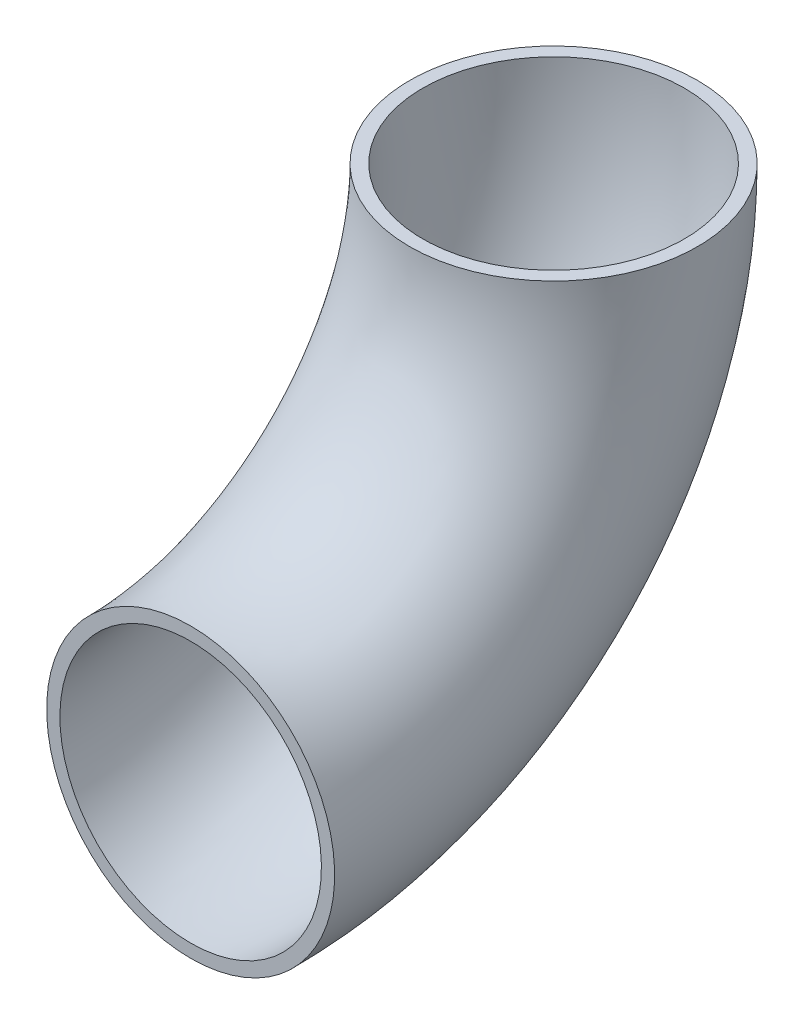
ISO-10303-21;
HEADER;
FILE_DESCRIPTION(('STEP AP214'),'2;1');
FILE_NAME('part.step','',(''),(''),'','','');
FILE_SCHEMA(('AUTOMOTIVE_DESIGN { 1 0 10303 214 1 1 1 1 }'));
ENDSEC;
DATA;
#1=APPLICATION_CONTEXT('core data for automotive mechanical design processes');
#2=APPLICATION_PROTOCOL_DEFINITION('international standard','automotive_design',2000,#1);
#3=PRODUCT_CONTEXT('',#1,'mechanical');
#4=PRODUCT('Part','Part','',(#3));
#5=PRODUCT_RELATED_PRODUCT_CATEGORY('part','',(#4));
#6=PRODUCT_DEFINITION_FORMATION('','',#4);
#7=PRODUCT_DEFINITION_CONTEXT('part definition',#1,'design');
#8=PRODUCT_DEFINITION('design','',#6,#7);
#9=PRODUCT_DEFINITION_SHAPE('','',#8);
#10=(LENGTH_UNIT() NAMED_UNIT(*) SI_UNIT(.MILLI.,.METRE.));
#11=(NAMED_UNIT(*) PLANE_ANGLE_UNIT() SI_UNIT($,.RADIAN.));
#12=(NAMED_UNIT(*) SI_UNIT($,.STERADIAN.) SOLID_ANGLE_UNIT());
#13=UNCERTAINTY_MEASURE_WITH_UNIT(LENGTH_MEASURE(1.E-05),#10,'distance_accuracy_value','');
#14=(GEOMETRIC_REPRESENTATION_CONTEXT(3) GLOBAL_UNCERTAINTY_ASSIGNED_CONTEXT((#13)) GLOBAL_UNIT_ASSIGNED_CONTEXT((#10,
#11,#12)) REPRESENTATION_CONTEXT('',''));
#15=CARTESIAN_POINT('',(0.,0.,0.));
#16=DIRECTION('',(0.,0.,1.));
#17=DIRECTION('',(1.,0.,0.));
#18=AXIS2_PLACEMENT_3D('',#15,#16,#17);
#19=CARTESIAN_POINT('',(0.,76.,0.));
#20=DIRECTION('',(-1.,0.,0.));
#21=DIRECTION('',(0.,0.,1.));
#22=AXIS2_PLACEMENT_3D('',#19,#20,#21);
#23=TOROIDAL_SURFACE('',#22,76.,27.38);
#24=CARTESIAN_POINT('',(0.,76.,-76.));
#25=DIRECTION('',(0.,-1.,0.));
#26=DIRECTION('',(1.,0.,0.));
#27=AXIS2_PLACEMENT_3D('',#24,#25,#26);
#28=CIRCLE('',#27,27.38);
#29=CARTESIAN_POINT('',(0.,76.,-103.38));
#30=VERTEX_POINT('',#29);
#31=EDGE_CURVE('E39',#30,#30,#28,.T.);
#32=CARTESIAN_POINT('',(0.,0.,0.));
#33=DIRECTION('',(0.,0.,1.));
#34=DIRECTION('',(1.,0.,0.));
#35=AXIS2_PLACEMENT_3D('',#32,#33,#34);
#36=CIRCLE('',#35,27.38);
#37=CARTESIAN_POINT('',(0.,-27.38,0.));
#38=VERTEX_POINT('',#37);
#39=EDGE_CURVE('E47',#38,#38,#36,.T.);
#40=CARTESIAN_POINT('',(0.,76.,0.));
#41=DIRECTION('',(-1.,0.,0.));
#42=DIRECTION('',(0.,0.,1.));
#43=AXIS2_PLACEMENT_3D('',#40,#41,#42);
#44=CIRCLE('',#43,103.38);
#45=EDGE_CURVE('',#30,#38,#44,.T.);
#46=ORIENTED_EDGE('',*,*,#31,.F.);
#47=ORIENTED_EDGE('',*,*,#39,.T.);
#48=ORIENTED_EDGE('',*,*,#45,.T.);
#49=ORIENTED_EDGE('',*,*,#45,.F.);
#50=EDGE_LOOP('',(#46,#48,#47,#49));
#51=FACE_BOUND('',#50,.T.);
#52=ADVANCED_FACE('F32',(#51),#23,.F.);
#53=CARTESIAN_POINT('',(0.,76.,0.));
#54=DIRECTION('',(-1.,0.,0.));
#55=DIRECTION('',(0.,0.,1.));
#56=AXIS2_PLACEMENT_3D('',#53,#54,#55);
#57=TOROIDAL_SURFACE('',#56,76.,30.15);
#58=CARTESIAN_POINT('',(0.,76.,-76.));
#59=DIRECTION('',(0.,-1.,0.));
#60=DIRECTION('',(1.,0.,0.));
#61=AXIS2_PLACEMENT_3D('',#58,#59,#60);
#62=CIRCLE('',#61,30.15);
#63=CARTESIAN_POINT('',(0.,76.,-106.15));
#64=VERTEX_POINT('',#63);
#65=EDGE_CURVE('E10',#64,#64,#62,.T.);
#66=CARTESIAN_POINT('',(0.,0.,0.));
#67=DIRECTION('',(0.,0.,1.));
#68=DIRECTION('',(1.,0.,0.));
#69=AXIS2_PLACEMENT_3D('',#66,#67,#68);
#70=CIRCLE('',#69,30.15);
#71=CARTESIAN_POINT('',(0.,-30.15,0.));
#72=VERTEX_POINT('',#71);
#73=EDGE_CURVE('E43',#72,#72,#70,.T.);
#74=CARTESIAN_POINT('',(0.,76.,0.));
#75=DIRECTION('',(-1.,0.,0.));
#76=DIRECTION('',(0.,0.,1.));
#77=AXIS2_PLACEMENT_3D('',#74,#75,#76);
#78=CIRCLE('',#77,106.15);
#79=EDGE_CURVE('',#64,#72,#78,.T.);
#80=ORIENTED_EDGE('',*,*,#65,.T.);
#81=ORIENTED_EDGE('',*,*,#73,.F.);
#82=ORIENTED_EDGE('',*,*,#79,.T.);
#83=ORIENTED_EDGE('',*,*,#79,.F.);
#84=EDGE_LOOP('',(#80,#82,#81,#83));
#85=FACE_BOUND('',#84,.T.);
#86=ADVANCED_FACE('F34',(#85),#57,.T.);
#87=CARTESIAN_POINT('',(0.,76.,-76.));
#88=DIRECTION('',(0.,-1.,0.));
#89=DIRECTION('',(1.,0.,0.));
#90=AXIS2_PLACEMENT_3D('',#87,#88,#89);
#91=PLANE('',#90);
#92=ORIENTED_EDGE('',*,*,#31,.T.);
#93=EDGE_LOOP('',(#92));
#94=FACE_BOUND('',#93,.T.);
#95=ORIENTED_EDGE('',*,*,#65,.F.);
#96=EDGE_LOOP('',(#95));
#97=FACE_BOUND('',#96,.T.);
#98=ADVANCED_FACE('F57',(#94,#97),#91,.F.);
#99=CARTESIAN_POINT('',(0.,0.,0.));
#100=DIRECTION('',(0.,0.,1.));
#101=DIRECTION('',(1.,0.,0.));
#102=AXIS2_PLACEMENT_3D('',#99,#100,#101);
#103=PLANE('',#102);
#104=ORIENTED_EDGE('',*,*,#39,.F.);
#105=EDGE_LOOP('',(#104));
#106=FACE_BOUND('',#105,.T.);
#107=ORIENTED_EDGE('',*,*,#73,.T.);
#108=EDGE_LOOP('',(#107));
#109=FACE_BOUND('',#108,.T.);
#110=ADVANCED_FACE('F54',(#106,#109),#103,.T.);
#111=CLOSED_SHELL('',(#52,#86,#98,#110));
#112=MANIFOLD_SOLID_BREP('B2',#111);
#113=ADVANCED_BREP_SHAPE_REPRESENTATION('',(#18,#112),#14);
#114=SHAPE_DEFINITION_REPRESENTATION(#9,#113);
ENDSEC;
END-ISO-10303-21;
